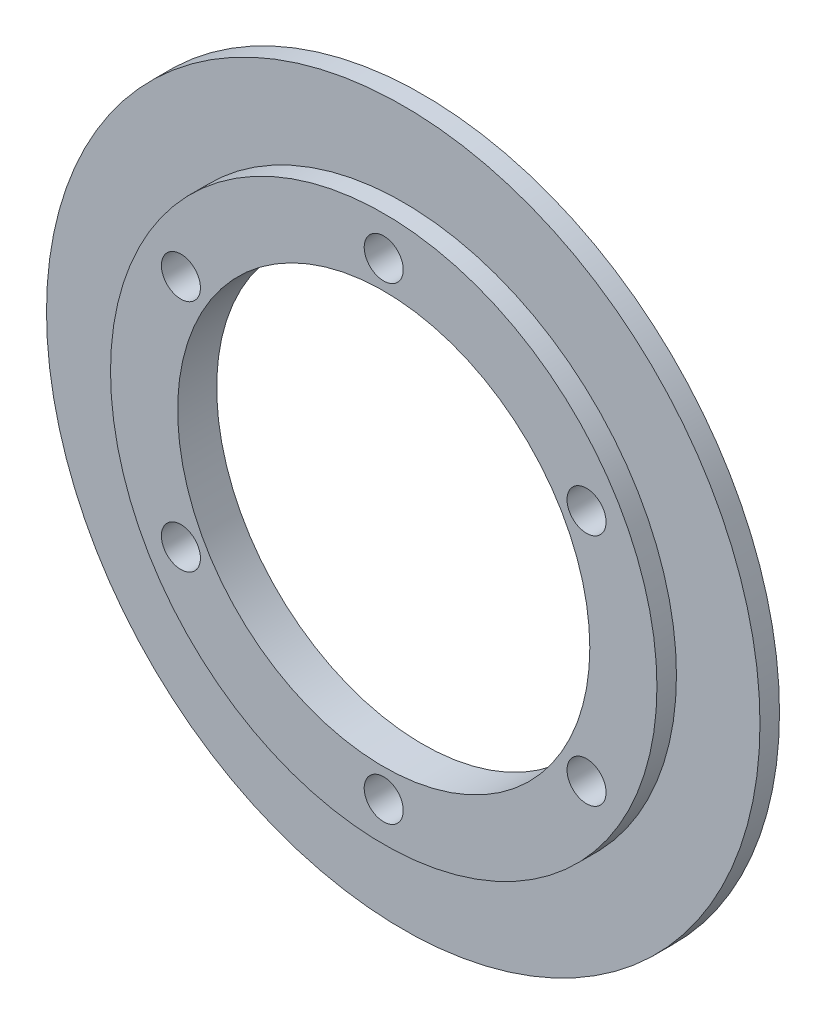
ISO-10303-21;
HEADER;
FILE_DESCRIPTION(('STEP AP214'),'2;1');
FILE_NAME('part.step','',(''),(''),'','','');
FILE_SCHEMA(('AUTOMOTIVE_DESIGN { 1 0 10303 214 1 1 1 1 }'));
ENDSEC;
DATA;
#1=APPLICATION_CONTEXT('core data for automotive mechanical design processes');
#2=APPLICATION_PROTOCOL_DEFINITION('international standard','automotive_design',2000,#1);
#3=PRODUCT_CONTEXT('',#1,'mechanical');
#4=PRODUCT('Part','Part','',(#3));
#5=PRODUCT_RELATED_PRODUCT_CATEGORY('part','',(#4));
#6=PRODUCT_DEFINITION_FORMATION('','',#4);
#7=PRODUCT_DEFINITION_CONTEXT('part definition',#1,'design');
#8=PRODUCT_DEFINITION('design','',#6,#7);
#9=PRODUCT_DEFINITION_SHAPE('','',#8);
#10=(LENGTH_UNIT() NAMED_UNIT(*) SI_UNIT(.MILLI.,.METRE.));
#11=(NAMED_UNIT(*) PLANE_ANGLE_UNIT() SI_UNIT($,.RADIAN.));
#12=(NAMED_UNIT(*) SI_UNIT($,.STERADIAN.) SOLID_ANGLE_UNIT());
#13=UNCERTAINTY_MEASURE_WITH_UNIT(LENGTH_MEASURE(1.E-05),#10,'distance_accuracy_value','');
#14=(GEOMETRIC_REPRESENTATION_CONTEXT(3) GLOBAL_UNCERTAINTY_ASSIGNED_CONTEXT((#13)) GLOBAL_UNIT_ASSIGNED_CONTEXT((#10,
#11,#12)) REPRESENTATION_CONTEXT('',''));
#15=CARTESIAN_POINT('',(0.,0.,0.));
#16=DIRECTION('',(0.,0.,1.));
#17=DIRECTION('',(1.,0.,0.));
#18=AXIS2_PLACEMENT_3D('',#15,#16,#17);
#19=CARTESIAN_POINT('',(0.,0.,25.));
#20=DIRECTION('',(0.,0.,-1.));
#21=DIRECTION('',(-1.,0.,0.));
#22=AXIS2_PLACEMENT_3D('',#19,#20,#21);
#23=CYLINDRICAL_SURFACE('',#22,457.);
#24=CARTESIAN_POINT('',(0.,0.,25.));
#25=DIRECTION('',(0.,0.,1.));
#26=DIRECTION('',(1.,0.,0.));
#27=AXIS2_PLACEMENT_3D('',#24,#25,#26);
#28=CIRCLE('',#27,457.);
#29=CARTESIAN_POINT('',(457.,0.,25.));
#30=VERTEX_POINT('',#29);
#31=EDGE_CURVE('E93',#30,#30,#28,.T.);
#32=ORIENTED_EDGE('',*,*,#31,.F.);
#33=EDGE_LOOP('',(#32));
#34=FACE_BOUND('',#33,.T.);
#35=CARTESIAN_POINT('',(0.,0.,0.));
#36=DIRECTION('',(0.,0.,1.));
#37=DIRECTION('',(1.,0.,0.));
#38=AXIS2_PLACEMENT_3D('',#35,#36,#37);
#39=CIRCLE('',#38,457.);
#40=CARTESIAN_POINT('',(457.,0.,0.));
#41=VERTEX_POINT('',#40);
#42=EDGE_CURVE('E99',#41,#41,#39,.T.);
#43=ORIENTED_EDGE('',*,*,#42,.T.);
#44=EDGE_LOOP('',(#43));
#45=FACE_BOUND('',#44,.T.);
#46=ADVANCED_FACE('F85',(#34,#45),#23,.T.);
#47=CARTESIAN_POINT('',(0.,0.,25.));
#48=DIRECTION('',(0.,0.,1.));
#49=DIRECTION('',(1.,0.,0.));
#50=AXIS2_PLACEMENT_3D('',#47,#48,#49);
#51=PLANE('',#50);
#52=CARTESIAN_POINT('',(0.,0.,25.));
#53=DIRECTION('',(0.,0.,1.));
#54=DIRECTION('',(1.,0.,0.));
#55=AXIS2_PLACEMENT_3D('',#52,#53,#54);
#56=CIRCLE('',#55,350.);
#57=CARTESIAN_POINT('',(350.,0.,25.));
#58=VERTEX_POINT('',#57);
#59=EDGE_CURVE('E11',#58,#58,#56,.T.);
#60=ORIENTED_EDGE('',*,*,#59,.F.);
#61=EDGE_LOOP('',(#60));
#62=FACE_BOUND('',#61,.T.);
#63=ORIENTED_EDGE('',*,*,#31,.T.);
#64=EDGE_LOOP('',(#63));
#65=FACE_BOUND('',#64,.T.);
#66=ADVANCED_FACE('F154',(#62,#65),#51,.T.);
#67=CARTESIAN_POINT('',(0.,0.,0.));
#68=DIRECTION('',(0.,0.,1.));
#69=DIRECTION('',(1.,0.,0.));
#70=AXIS2_PLACEMENT_3D('',#67,#68,#69);
#71=PLANE('',#70);
#72=CARTESIAN_POINT('',(259.807621135332,-150.,0.));
#73=DIRECTION('',(0.,0.,1.));
#74=DIRECTION('',(1.,0.,0.));
#75=AXIS2_PLACEMENT_3D('',#72,#73,#74);
#76=CIRCLE('',#75,25.);
#77=CARTESIAN_POINT('',(284.807621135332,-150.,0.));
#78=VERTEX_POINT('',#77);
#79=EDGE_CURVE('E256',#78,#78,#76,.T.);
#80=ORIENTED_EDGE('',*,*,#79,.T.);
#81=EDGE_LOOP('',(#80));
#82=FACE_BOUND('',#81,.T.);
#83=CARTESIAN_POINT('',(-259.807621135331,-150.,0.));
#84=DIRECTION('',(0.,0.,1.));
#85=DIRECTION('',(1.,0.,0.));
#86=AXIS2_PLACEMENT_3D('',#83,#84,#85);
#87=CIRCLE('',#86,25.);
#88=CARTESIAN_POINT('',(-234.807621135331,-150.,0.));
#89=VERTEX_POINT('',#88);
#90=EDGE_CURVE('E258',#89,#89,#87,.T.);
#91=ORIENTED_EDGE('',*,*,#90,.T.);
#92=EDGE_LOOP('',(#91));
#93=FACE_BOUND('',#92,.T.);
#94=CARTESIAN_POINT('',(0.,300.,0.));
#95=DIRECTION('',(0.,0.,1.));
#96=DIRECTION('',(1.,0.,0.));
#97=AXIS2_PLACEMENT_3D('',#94,#95,#96);
#98=CIRCLE('',#97,25.);
#99=CARTESIAN_POINT('',(25.,300.,0.));
#100=VERTEX_POINT('',#99);
#101=EDGE_CURVE('E264',#100,#100,#98,.T.);
#102=ORIENTED_EDGE('',*,*,#101,.T.);
#103=EDGE_LOOP('',(#102));
#104=FACE_BOUND('',#103,.T.);
#105=CARTESIAN_POINT('',(-259.807621135332,150.,0.));
#106=DIRECTION('',(0.,0.,1.));
#107=DIRECTION('',(1.,0.,0.));
#108=AXIS2_PLACEMENT_3D('',#105,#106,#107);
#109=CIRCLE('',#108,25.);
#110=CARTESIAN_POINT('',(-234.807621135332,150.,0.));
#111=VERTEX_POINT('',#110);
#112=EDGE_CURVE('E273',#111,#111,#109,.T.);
#113=ORIENTED_EDGE('',*,*,#112,.T.);
#114=EDGE_LOOP('',(#113));
#115=FACE_BOUND('',#114,.T.);
#116=CARTESIAN_POINT('',(259.807621135332,150.,0.));
#117=DIRECTION('',(0.,0.,1.));
#118=DIRECTION('',(1.,0.,0.));
#119=AXIS2_PLACEMENT_3D('',#116,#117,#118);
#120=CIRCLE('',#119,25.0000000000005);
#121=CARTESIAN_POINT('',(284.807621135332,150.,0.));
#122=VERTEX_POINT('',#121);
#123=EDGE_CURVE('E276',#122,#122,#120,.T.);
#124=ORIENTED_EDGE('',*,*,#123,.T.);
#125=EDGE_LOOP('',(#124));
#126=FACE_BOUND('',#125,.T.);
#127=CARTESIAN_POINT('',(0.,-300.,0.));
#128=DIRECTION('',(0.,0.,1.));
#129=DIRECTION('',(1.,0.,0.));
#130=AXIS2_PLACEMENT_3D('',#127,#128,#129);
#131=CIRCLE('',#130,25.);
#132=CARTESIAN_POINT('',(25.,-300.,0.));
#133=VERTEX_POINT('',#132);
#134=EDGE_CURVE('E267',#133,#133,#131,.T.);
#135=ORIENTED_EDGE('',*,*,#134,.T.);
#136=EDGE_LOOP('',(#135));
#137=FACE_BOUND('',#136,.T.);
#138=CARTESIAN_POINT('',(0.,-1.66533453693956E-13,0.));
#139=DIRECTION('',(0.,0.,1.));
#140=DIRECTION('',(1.,0.,0.));
#141=AXIS2_PLACEMENT_3D('',#138,#139,#140);
#142=CIRCLE('',#141,264.);
#143=CARTESIAN_POINT('',(264.,-1.66533453693956E-13,0.));
#144=VERTEX_POINT('',#143);
#145=EDGE_CURVE('E113',#144,#144,#142,.T.);
#146=ORIENTED_EDGE('',*,*,#145,.T.);
#147=EDGE_LOOP('',(#146));
#148=FACE_BOUND('',#147,.T.);
#149=ORIENTED_EDGE('',*,*,#42,.F.);
#150=EDGE_LOOP('',(#149));
#151=FACE_BOUND('',#150,.T.);
#152=ADVANCED_FACE('F145',(#82,#93,#104,#115,#126,#137,#148,#151),#71,.F.);
#153=CARTESIAN_POINT('',(0.,0.,50.));
#154=DIRECTION('',(0.,0.,-1.));
#155=DIRECTION('',(-1.,0.,0.));
#156=AXIS2_PLACEMENT_3D('',#153,#154,#155);
#157=CYLINDRICAL_SURFACE('',#156,350.);
#158=CARTESIAN_POINT('',(0.,0.,50.));
#159=DIRECTION('',(0.,0.,1.));
#160=DIRECTION('',(1.,0.,0.));
#161=AXIS2_PLACEMENT_3D('',#158,#159,#160);
#162=CIRCLE('',#161,350.);
#163=CARTESIAN_POINT('',(350.,0.,50.));
#164=VERTEX_POINT('',#163);
#165=EDGE_CURVE('E102',#164,#164,#162,.T.);
#166=ORIENTED_EDGE('',*,*,#165,.F.);
#167=EDGE_LOOP('',(#166));
#168=FACE_BOUND('',#167,.T.);
#169=ORIENTED_EDGE('',*,*,#59,.T.);
#170=EDGE_LOOP('',(#169));
#171=FACE_BOUND('',#170,.T.);
#172=ADVANCED_FACE('F143',(#168,#171),#157,.T.);
#173=CARTESIAN_POINT('',(0.,0.,50.));
#174=DIRECTION('',(0.,0.,1.));
#175=DIRECTION('',(1.,0.,0.));
#176=AXIS2_PLACEMENT_3D('',#173,#174,#175);
#177=PLANE('',#176);
#178=CARTESIAN_POINT('',(259.807621135332,-150.,50.));
#179=DIRECTION('',(0.,0.,1.));
#180=DIRECTION('',(1.,0.,0.));
#181=AXIS2_PLACEMENT_3D('',#178,#179,#180);
#182=CIRCLE('',#181,25.);
#183=CARTESIAN_POINT('',(284.807621135332,-150.,50.));
#184=VERTEX_POINT('',#183);
#185=EDGE_CURVE('E88',#184,#184,#182,.T.);
#186=ORIENTED_EDGE('',*,*,#185,.F.);
#187=EDGE_LOOP('',(#186));
#188=FACE_BOUND('',#187,.T.);
#189=CARTESIAN_POINT('',(-259.807621135331,-150.,50.));
#190=DIRECTION('',(0.,0.,1.));
#191=DIRECTION('',(1.,0.,0.));
#192=AXIS2_PLACEMENT_3D('',#189,#190,#191);
#193=CIRCLE('',#192,25.);
#194=CARTESIAN_POINT('',(-234.807621135331,-150.,50.));
#195=VERTEX_POINT('',#194);
#196=EDGE_CURVE('E128',#195,#195,#193,.T.);
#197=ORIENTED_EDGE('',*,*,#196,.F.);
#198=EDGE_LOOP('',(#197));
#199=FACE_BOUND('',#198,.T.);
#200=CARTESIAN_POINT('',(0.,300.,50.));
#201=DIRECTION('',(0.,0.,1.));
#202=DIRECTION('',(1.,0.,0.));
#203=AXIS2_PLACEMENT_3D('',#200,#201,#202);
#204=CIRCLE('',#203,25.);
#205=CARTESIAN_POINT('',(25.,300.,50.));
#206=VERTEX_POINT('',#205);
#207=EDGE_CURVE('E125',#206,#206,#204,.T.);
#208=ORIENTED_EDGE('',*,*,#207,.F.);
#209=EDGE_LOOP('',(#208));
#210=FACE_BOUND('',#209,.T.);
#211=CARTESIAN_POINT('',(-259.807621135332,150.,50.));
#212=DIRECTION('',(0.,0.,1.));
#213=DIRECTION('',(1.,0.,0.));
#214=AXIS2_PLACEMENT_3D('',#211,#212,#213);
#215=CIRCLE('',#214,25.);
#216=CARTESIAN_POINT('',(-234.807621135332,150.,50.));
#217=VERTEX_POINT('',#216);
#218=EDGE_CURVE('E121',#217,#217,#215,.T.);
#219=ORIENTED_EDGE('',*,*,#218,.F.);
#220=EDGE_LOOP('',(#219));
#221=FACE_BOUND('',#220,.T.);
#222=CARTESIAN_POINT('',(259.807621135332,150.,50.));
#223=DIRECTION('',(0.,0.,1.));
#224=DIRECTION('',(1.,0.,0.));
#225=AXIS2_PLACEMENT_3D('',#222,#223,#224);
#226=CIRCLE('',#225,25.0000000000005);
#227=CARTESIAN_POINT('',(284.807621135332,150.,50.));
#228=VERTEX_POINT('',#227);
#229=EDGE_CURVE('E117',#228,#228,#226,.T.);
#230=ORIENTED_EDGE('',*,*,#229,.F.);
#231=EDGE_LOOP('',(#230));
#232=FACE_BOUND('',#231,.T.);
#233=CARTESIAN_POINT('',(0.,-300.,50.));
#234=DIRECTION('',(0.,0.,1.));
#235=DIRECTION('',(1.,0.,0.));
#236=AXIS2_PLACEMENT_3D('',#233,#234,#235);
#237=CIRCLE('',#236,25.);
#238=CARTESIAN_POINT('',(25.,-300.,50.));
#239=VERTEX_POINT('',#238);
#240=EDGE_CURVE('E112',#239,#239,#237,.T.);
#241=ORIENTED_EDGE('',*,*,#240,.F.);
#242=EDGE_LOOP('',(#241));
#243=FACE_BOUND('',#242,.T.);
#244=CARTESIAN_POINT('',(0.,-1.66533453693956E-13,50.));
#245=DIRECTION('',(0.,0.,1.));
#246=DIRECTION('',(1.,0.,0.));
#247=AXIS2_PLACEMENT_3D('',#244,#245,#246);
#248=CIRCLE('',#247,264.);
#249=CARTESIAN_POINT('',(264.,-1.66533453693956E-13,50.));
#250=VERTEX_POINT('',#249);
#251=EDGE_CURVE('E108',#250,#250,#248,.T.);
#252=ORIENTED_EDGE('',*,*,#251,.F.);
#253=EDGE_LOOP('',(#252));
#254=FACE_BOUND('',#253,.T.);
#255=ORIENTED_EDGE('',*,*,#165,.T.);
#256=EDGE_LOOP('',(#255));
#257=FACE_BOUND('',#256,.T.);
#258=ADVANCED_FACE('F141',(#188,#199,#210,#221,#232,#243,#254,#257),#177,.T.);
#259=CARTESIAN_POINT('',(0.,-1.66533453693956E-13,0.));
#260=DIRECTION('',(0.,0.,1.));
#261=DIRECTION('',(1.,0.,0.));
#262=AXIS2_PLACEMENT_3D('',#259,#260,#261);
#263=CYLINDRICAL_SURFACE('',#262,264.);
#264=ORIENTED_EDGE('',*,*,#251,.T.);
#265=EDGE_LOOP('',(#264));
#266=FACE_BOUND('',#265,.T.);
#267=ORIENTED_EDGE('',*,*,#145,.F.);
#268=EDGE_LOOP('',(#267));
#269=FACE_BOUND('',#268,.T.);
#270=ADVANCED_FACE('F151',(#266,#269),#263,.F.);
#271=CARTESIAN_POINT('',(0.,-300.,0.));
#272=DIRECTION('',(0.,0.,1.));
#273=DIRECTION('',(1.,0.,0.));
#274=AXIS2_PLACEMENT_3D('',#271,#272,#273);
#275=CYLINDRICAL_SURFACE('',#274,25.);
#276=ORIENTED_EDGE('',*,*,#240,.T.);
#277=EDGE_LOOP('',(#276));
#278=FACE_BOUND('',#277,.T.);
#279=ORIENTED_EDGE('',*,*,#134,.F.);
#280=EDGE_LOOP('',(#279));
#281=FACE_BOUND('',#280,.T.);
#282=ADVANCED_FACE('F191',(#278,#281),#275,.F.);
#283=CARTESIAN_POINT('',(259.807621135332,150.,0.));
#284=DIRECTION('',(0.,0.,1.));
#285=DIRECTION('',(1.,0.,0.));
#286=AXIS2_PLACEMENT_3D('',#283,#284,#285);
#287=CYLINDRICAL_SURFACE('',#286,25.0000000000005);
#288=ORIENTED_EDGE('',*,*,#229,.T.);
#289=EDGE_LOOP('',(#288));
#290=FACE_BOUND('',#289,.T.);
#291=ORIENTED_EDGE('',*,*,#123,.F.);
#292=EDGE_LOOP('',(#291));
#293=FACE_BOUND('',#292,.T.);
#294=ADVANCED_FACE('F201',(#290,#293),#287,.F.);
#295=CARTESIAN_POINT('',(-259.807621135332,150.,0.));
#296=DIRECTION('',(0.,0.,1.));
#297=DIRECTION('',(1.,0.,0.));
#298=AXIS2_PLACEMENT_3D('',#295,#296,#297);
#299=CYLINDRICAL_SURFACE('',#298,25.);
#300=ORIENTED_EDGE('',*,*,#218,.T.);
#301=EDGE_LOOP('',(#300));
#302=FACE_BOUND('',#301,.T.);
#303=ORIENTED_EDGE('',*,*,#112,.F.);
#304=EDGE_LOOP('',(#303));
#305=FACE_BOUND('',#304,.T.);
#306=ADVANCED_FACE('F211',(#302,#305),#299,.F.);
#307=CARTESIAN_POINT('',(0.,300.,0.));
#308=DIRECTION('',(0.,0.,1.));
#309=DIRECTION('',(1.,0.,0.));
#310=AXIS2_PLACEMENT_3D('',#307,#308,#309);
#311=CYLINDRICAL_SURFACE('',#310,25.);
#312=ORIENTED_EDGE('',*,*,#207,.T.);
#313=EDGE_LOOP('',(#312));
#314=FACE_BOUND('',#313,.T.);
#315=ORIENTED_EDGE('',*,*,#101,.F.);
#316=EDGE_LOOP('',(#315));
#317=FACE_BOUND('',#316,.T.);
#318=ADVANCED_FACE('F221',(#314,#317),#311,.F.);
#319=CARTESIAN_POINT('',(-259.807621135331,-150.,0.));
#320=DIRECTION('',(0.,0.,1.));
#321=DIRECTION('',(1.,0.,0.));
#322=AXIS2_PLACEMENT_3D('',#319,#320,#321);
#323=CYLINDRICAL_SURFACE('',#322,25.);
#324=ORIENTED_EDGE('',*,*,#196,.T.);
#325=EDGE_LOOP('',(#324));
#326=FACE_BOUND('',#325,.T.);
#327=ORIENTED_EDGE('',*,*,#90,.F.);
#328=EDGE_LOOP('',(#327));
#329=FACE_BOUND('',#328,.T.);
#330=ADVANCED_FACE('F231',(#326,#329),#323,.F.);
#331=CARTESIAN_POINT('',(259.807621135332,-150.,0.));
#332=DIRECTION('',(0.,0.,1.));
#333=DIRECTION('',(1.,0.,0.));
#334=AXIS2_PLACEMENT_3D('',#331,#332,#333);
#335=CYLINDRICAL_SURFACE('',#334,25.);
#336=ORIENTED_EDGE('',*,*,#185,.T.);
#337=EDGE_LOOP('',(#336));
#338=FACE_BOUND('',#337,.T.);
#339=ORIENTED_EDGE('',*,*,#79,.F.);
#340=EDGE_LOOP('',(#339));
#341=FACE_BOUND('',#340,.T.);
#342=ADVANCED_FACE('F241',(#338,#341),#335,.F.);
#343=CLOSED_SHELL('',(#46,#66,#152,#172,#258,#270,#282,#294,#306,#318,#330,#342));
#344=MANIFOLD_SOLID_BREP('B2',#343);
#345=ADVANCED_BREP_SHAPE_REPRESENTATION('',(#18,#344),#14);
#346=SHAPE_DEFINITION_REPRESENTATION(#9,#345);
ENDSEC;
END-ISO-10303-21;
